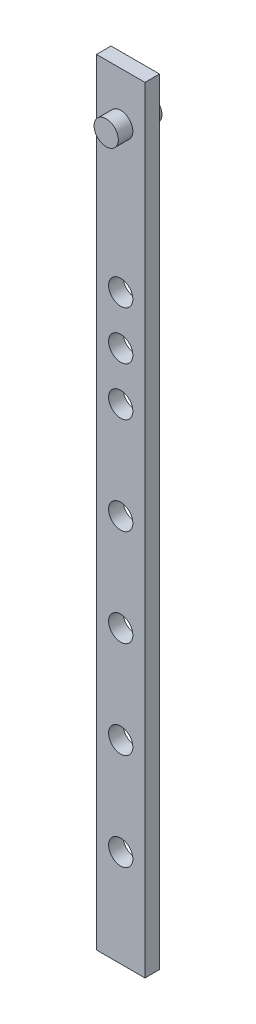
ISO-10303-21;
HEADER;
FILE_DESCRIPTION(('STEP AP214'),'2;1');
FILE_NAME('part.step','',(''),(''),'','','');
FILE_SCHEMA(('AUTOMOTIVE_DESIGN { 1 0 10303 214 1 1 1 1 }'));
ENDSEC;
DATA;
#1=APPLICATION_CONTEXT('core data for automotive mechanical design processes');
#2=APPLICATION_PROTOCOL_DEFINITION('international standard','automotive_design',2000,#1);
#3=PRODUCT_CONTEXT('',#1,'mechanical');
#4=PRODUCT('Part','Part','',(#3));
#5=PRODUCT_RELATED_PRODUCT_CATEGORY('part','',(#4));
#6=PRODUCT_DEFINITION_FORMATION('','',#4);
#7=PRODUCT_DEFINITION_CONTEXT('part definition',#1,'design');
#8=PRODUCT_DEFINITION('design','',#6,#7);
#9=PRODUCT_DEFINITION_SHAPE('','',#8);
#10=(LENGTH_UNIT() NAMED_UNIT(*) SI_UNIT(.MILLI.,.METRE.));
#11=(NAMED_UNIT(*) PLANE_ANGLE_UNIT() SI_UNIT($,.RADIAN.));
#12=(NAMED_UNIT(*) SI_UNIT($,.STERADIAN.) SOLID_ANGLE_UNIT());
#13=UNCERTAINTY_MEASURE_WITH_UNIT(LENGTH_MEASURE(1.E-05),#10,'distance_accuracy_value','');
#14=(GEOMETRIC_REPRESENTATION_CONTEXT(3) GLOBAL_UNCERTAINTY_ASSIGNED_CONTEXT((#13)) GLOBAL_UNIT_ASSIGNED_CONTEXT((#10,
#11,#12)) REPRESENTATION_CONTEXT('',''));
#15=CARTESIAN_POINT('',(0.,0.,0.));
#16=DIRECTION('',(0.,0.,1.));
#17=DIRECTION('',(1.,0.,0.));
#18=AXIS2_PLACEMENT_3D('',#15,#16,#17);
#19=CARTESIAN_POINT('',(0.,0.,3.));
#20=DIRECTION('',(0.,0.,-1.));
#21=DIRECTION('',(-1.,0.,0.));
#22=AXIS2_PLACEMENT_3D('',#19,#20,#21);
#23=PLANE('',#22);
#24=CARTESIAN_POINT('',(0.,70.,3.));
#25=DIRECTION('',(0.,0.,-1.));
#26=DIRECTION('',(-1.,0.,0.));
#27=AXIS2_PLACEMENT_3D('',#24,#25,#26);
#28=CIRCLE('',#27,2.5);
#29=CARTESIAN_POINT('',(-2.5,70.,3.));
#30=VERTEX_POINT('',#29);
#31=EDGE_CURVE('E11',#30,#30,#28,.F.);
#32=ORIENTED_EDGE('',*,*,#31,.F.);
#33=EDGE_LOOP('',(#32));
#34=FACE_BOUND('',#33,.T.);
#35=DIRECTION('',(0.,1.,0.));
#36=VECTOR('',#35,1.);
#37=CARTESIAN_POINT('',(4.99999999999997,-80.,3.));
#38=LINE('',#37,#36);
#39=CARTESIAN_POINT('',(4.99999999999997,-80.,3.));
#40=VERTEX_POINT('',#39);
#41=CARTESIAN_POINT('',(5.00000000000003,80.,3.));
#42=VERTEX_POINT('',#41);
#43=EDGE_CURVE('E88',#40,#42,#38,.T.);
#44=ORIENTED_EDGE('',*,*,#43,.T.);
#45=DIRECTION('',(-1.,0.,0.));
#46=VECTOR('',#45,1.);
#47=CARTESIAN_POINT('',(-4.99999999999997,80.,3.));
#48=LINE('',#47,#46);
#49=CARTESIAN_POINT('',(-4.99999999999997,80.,3.));
#50=VERTEX_POINT('',#49);
#51=EDGE_CURVE('E83',#42,#50,#48,.T.);
#52=ORIENTED_EDGE('',*,*,#51,.T.);
#53=DIRECTION('',(0.,-1.,0.));
#54=VECTOR('',#53,1.);
#55=CARTESIAN_POINT('',(-4.99999999999997,-80.,3.));
#56=LINE('',#55,#54);
#57=CARTESIAN_POINT('',(-4.99999999999997,-80.,3.));
#58=VERTEX_POINT('',#57);
#59=EDGE_CURVE('E86',#50,#58,#56,.T.);
#60=ORIENTED_EDGE('',*,*,#59,.T.);
#61=DIRECTION('',(1.,0.,0.));
#62=VECTOR('',#61,1.);
#63=CARTESIAN_POINT('',(-4.99999999999997,-80.,3.));
#64=LINE('',#63,#62);
#65=EDGE_CURVE('E52',#58,#40,#64,.T.);
#66=ORIENTED_EDGE('',*,*,#65,.T.);
#67=EDGE_LOOP('',(#44,#52,#60,#66));
#68=FACE_BOUND('',#67,.T.);
#69=CARTESIAN_POINT('',(0.,-60.,3.));
#70=DIRECTION('',(0.,0.,1.));
#71=DIRECTION('',(1.,0.,0.));
#72=AXIS2_PLACEMENT_3D('',#69,#70,#71);
#73=CIRCLE('',#72,2.5);
#74=CARTESIAN_POINT('',(2.5,-60.,3.));
#75=VERTEX_POINT('',#74);
#76=EDGE_CURVE('E105',#75,#75,#73,.T.);
#77=ORIENTED_EDGE('',*,*,#76,.F.);
#78=EDGE_LOOP('',(#77));
#79=FACE_BOUND('',#78,.T.);
#80=CARTESIAN_POINT('',(0.,-40.,3.));
#81=DIRECTION('',(0.,0.,1.));
#82=DIRECTION('',(1.,0.,0.));
#83=AXIS2_PLACEMENT_3D('',#80,#81,#82);
#84=CIRCLE('',#83,2.5);
#85=CARTESIAN_POINT('',(2.5,-40.,3.));
#86=VERTEX_POINT('',#85);
#87=EDGE_CURVE('E162',#86,#86,#84,.T.);
#88=ORIENTED_EDGE('',*,*,#87,.F.);
#89=EDGE_LOOP('',(#88));
#90=FACE_BOUND('',#89,.T.);
#91=CARTESIAN_POINT('',(0.,-20.,3.));
#92=DIRECTION('',(0.,0.,1.));
#93=DIRECTION('',(1.,0.,0.));
#94=AXIS2_PLACEMENT_3D('',#91,#92,#93);
#95=CIRCLE('',#94,2.5);
#96=CARTESIAN_POINT('',(2.5,-20.,3.));
#97=VERTEX_POINT('',#96);
#98=EDGE_CURVE('E157',#97,#97,#95,.T.);
#99=ORIENTED_EDGE('',*,*,#98,.F.);
#100=EDGE_LOOP('',(#99));
#101=FACE_BOUND('',#100,.T.);
#102=CARTESIAN_POINT('',(0.,0.,3.));
#103=DIRECTION('',(0.,0.,1.));
#104=DIRECTION('',(1.,0.,0.));
#105=AXIS2_PLACEMENT_3D('',#102,#103,#104);
#106=CIRCLE('',#105,2.5);
#107=CARTESIAN_POINT('',(2.5,0.,3.));
#108=VERTEX_POINT('',#107);
#109=EDGE_CURVE('E152',#108,#108,#106,.T.);
#110=ORIENTED_EDGE('',*,*,#109,.F.);
#111=EDGE_LOOP('',(#110));
#112=FACE_BOUND('',#111,.T.);
#113=CARTESIAN_POINT('',(0.,20.,3.));
#114=DIRECTION('',(0.,0.,1.));
#115=DIRECTION('',(1.,0.,0.));
#116=AXIS2_PLACEMENT_3D('',#113,#114,#115);
#117=CIRCLE('',#116,2.5);
#118=CARTESIAN_POINT('',(2.5,20.,3.));
#119=VERTEX_POINT('',#118);
#120=EDGE_CURVE('E147',#119,#119,#117,.T.);
#121=ORIENTED_EDGE('',*,*,#120,.F.);
#122=EDGE_LOOP('',(#121));
#123=FACE_BOUND('',#122,.T.);
#124=CARTESIAN_POINT('',(0.,40.,3.));
#125=DIRECTION('',(0.,0.,1.));
#126=DIRECTION('',(1.,0.,0.));
#127=AXIS2_PLACEMENT_3D('',#124,#125,#126);
#128=CIRCLE('',#127,2.5);
#129=CARTESIAN_POINT('',(2.5,40.,3.));
#130=VERTEX_POINT('',#129);
#131=EDGE_CURVE('E142',#130,#130,#128,.T.);
#132=ORIENTED_EDGE('',*,*,#131,.F.);
#133=EDGE_LOOP('',(#132));
#134=FACE_BOUND('',#133,.T.);
#135=CARTESIAN_POINT('',(0.,30.,3.));
#136=DIRECTION('',(0.,0.,1.));
#137=DIRECTION('',(1.,0.,0.));
#138=AXIS2_PLACEMENT_3D('',#135,#136,#137);
#139=CIRCLE('',#138,2.5);
#140=CARTESIAN_POINT('',(2.5,30.,3.));
#141=VERTEX_POINT('',#140);
#142=EDGE_CURVE('E134',#141,#141,#139,.T.);
#143=ORIENTED_EDGE('',*,*,#142,.F.);
#144=EDGE_LOOP('',(#143));
#145=FACE_BOUND('',#144,.T.);
#146=ADVANCED_FACE('F33',(#34,#68,#79,#90,#101,#112,#123,#134,#145),#23,.F.);
#147=CARTESIAN_POINT('',(0.,0.,0.));
#148=DIRECTION('',(0.,0.,-1.));
#149=DIRECTION('',(-1.,0.,0.));
#150=AXIS2_PLACEMENT_3D('',#147,#148,#149);
#151=PLANE('',#150);
#152=CARTESIAN_POINT('',(0.,70.,0.));
#153=DIRECTION('',(0.,0.,-1.));
#154=DIRECTION('',(-1.,0.,0.));
#155=AXIS2_PLACEMENT_3D('',#152,#153,#154);
#156=CIRCLE('',#155,2.5);
#157=CARTESIAN_POINT('',(-2.5,70.,0.));
#158=VERTEX_POINT('',#157);
#159=EDGE_CURVE('E37',#158,#158,#156,.F.);
#160=ORIENTED_EDGE('',*,*,#159,.T.);
#161=EDGE_LOOP('',(#160));
#162=FACE_BOUND('',#161,.T.);
#163=CARTESIAN_POINT('',(0.,40.,0.));
#164=DIRECTION('',(0.,0.,1.));
#165=DIRECTION('',(1.,0.,0.));
#166=AXIS2_PLACEMENT_3D('',#163,#164,#165);
#167=CIRCLE('',#166,2.5);
#168=CARTESIAN_POINT('',(2.5,40.,0.));
#169=VERTEX_POINT('',#168);
#170=EDGE_CURVE('E137',#169,#169,#167,.T.);
#171=ORIENTED_EDGE('',*,*,#170,.T.);
#172=EDGE_LOOP('',(#171));
#173=FACE_BOUND('',#172,.T.);
#174=CARTESIAN_POINT('',(0.,0.,0.));
#175=DIRECTION('',(0.,0.,1.));
#176=DIRECTION('',(1.,0.,0.));
#177=AXIS2_PLACEMENT_3D('',#174,#175,#176);
#178=CIRCLE('',#177,2.5);
#179=CARTESIAN_POINT('',(2.5,0.,0.));
#180=VERTEX_POINT('',#179);
#181=EDGE_CURVE('E150',#180,#180,#178,.T.);
#182=ORIENTED_EDGE('',*,*,#181,.T.);
#183=EDGE_LOOP('',(#182));
#184=FACE_BOUND('',#183,.T.);
#185=CARTESIAN_POINT('',(0.,-40.,0.));
#186=DIRECTION('',(0.,0.,1.));
#187=DIRECTION('',(1.,0.,0.));
#188=AXIS2_PLACEMENT_3D('',#185,#186,#187);
#189=CIRCLE('',#188,2.5);
#190=CARTESIAN_POINT('',(2.5,-40.,0.));
#191=VERTEX_POINT('',#190);
#192=EDGE_CURVE('E160',#191,#191,#189,.T.);
#193=ORIENTED_EDGE('',*,*,#192,.T.);
#194=EDGE_LOOP('',(#193));
#195=FACE_BOUND('',#194,.T.);
#196=DIRECTION('',(0.,1.,0.));
#197=VECTOR('',#196,1.);
#198=CARTESIAN_POINT('',(4.99999999999997,-80.,0.));
#199=LINE('',#198,#197);
#200=CARTESIAN_POINT('',(4.99999999999997,-80.,0.));
#201=VERTEX_POINT('',#200);
#202=CARTESIAN_POINT('',(5.00000000000003,80.,0.));
#203=VERTEX_POINT('',#202);
#204=EDGE_CURVE('E102',#201,#203,#199,.T.);
#205=ORIENTED_EDGE('',*,*,#204,.F.);
#206=DIRECTION('',(1.,0.,0.));
#207=VECTOR('',#206,1.);
#208=CARTESIAN_POINT('',(-4.99999999999997,-80.,0.));
#209=LINE('',#208,#207);
#210=CARTESIAN_POINT('',(-4.99999999999997,-80.,0.));
#211=VERTEX_POINT('',#210);
#212=EDGE_CURVE('E75',#211,#201,#209,.T.);
#213=ORIENTED_EDGE('',*,*,#212,.F.);
#214=DIRECTION('',(0.,-1.,0.));
#215=VECTOR('',#214,1.);
#216=CARTESIAN_POINT('',(-4.99999999999997,-80.,0.));
#217=LINE('',#216,#215);
#218=CARTESIAN_POINT('',(-4.99999999999997,80.,0.));
#219=VERTEX_POINT('',#218);
#220=EDGE_CURVE('E69',#219,#211,#217,.T.);
#221=ORIENTED_EDGE('',*,*,#220,.F.);
#222=DIRECTION('',(-1.,0.,0.));
#223=VECTOR('',#222,1.);
#224=CARTESIAN_POINT('',(-4.99999999999997,80.,0.));
#225=LINE('',#224,#223);
#226=EDGE_CURVE('E93',#203,#219,#225,.T.);
#227=ORIENTED_EDGE('',*,*,#226,.F.);
#228=EDGE_LOOP('',(#205,#213,#221,#227));
#229=FACE_BOUND('',#228,.T.);
#230=CARTESIAN_POINT('',(0.,-60.,0.));
#231=DIRECTION('',(0.,0.,1.));
#232=DIRECTION('',(1.,0.,0.));
#233=AXIS2_PLACEMENT_3D('',#230,#231,#232);
#234=CIRCLE('',#233,2.5);
#235=CARTESIAN_POINT('',(2.5,-60.,0.));
#236=VERTEX_POINT('',#235);
#237=EDGE_CURVE('E121',#236,#236,#234,.T.);
#238=ORIENTED_EDGE('',*,*,#237,.T.);
#239=EDGE_LOOP('',(#238));
#240=FACE_BOUND('',#239,.T.);
#241=CARTESIAN_POINT('',(0.,-20.,0.));
#242=DIRECTION('',(0.,0.,1.));
#243=DIRECTION('',(1.,0.,0.));
#244=AXIS2_PLACEMENT_3D('',#241,#242,#243);
#245=CIRCLE('',#244,2.5);
#246=CARTESIAN_POINT('',(2.5,-20.,0.));
#247=VERTEX_POINT('',#246);
#248=EDGE_CURVE('E125',#247,#247,#245,.T.);
#249=ORIENTED_EDGE('',*,*,#248,.T.);
#250=EDGE_LOOP('',(#249));
#251=FACE_BOUND('',#250,.T.);
#252=CARTESIAN_POINT('',(0.,20.,0.));
#253=DIRECTION('',(0.,0.,1.));
#254=DIRECTION('',(1.,0.,0.));
#255=AXIS2_PLACEMENT_3D('',#252,#253,#254);
#256=CIRCLE('',#255,2.5);
#257=CARTESIAN_POINT('',(2.5,20.,0.));
#258=VERTEX_POINT('',#257);
#259=EDGE_CURVE('E129',#258,#258,#256,.T.);
#260=ORIENTED_EDGE('',*,*,#259,.T.);
#261=EDGE_LOOP('',(#260));
#262=FACE_BOUND('',#261,.T.);
#263=CARTESIAN_POINT('',(0.,30.,0.));
#264=DIRECTION('',(0.,0.,1.));
#265=DIRECTION('',(1.,0.,0.));
#266=AXIS2_PLACEMENT_3D('',#263,#264,#265);
#267=CIRCLE('',#266,2.5);
#268=CARTESIAN_POINT('',(2.5,30.,0.));
#269=VERTEX_POINT('',#268);
#270=EDGE_CURVE('E132',#269,#269,#267,.T.);
#271=ORIENTED_EDGE('',*,*,#270,.T.);
#272=EDGE_LOOP('',(#271));
#273=FACE_BOUND('',#272,.T.);
#274=ADVANCED_FACE('F113',(#162,#173,#184,#195,#229,#240,#251,#262,#273),#151,.T.);
#275=CARTESIAN_POINT('',(4.99999999999997,-80.,3.));
#276=DIRECTION('',(-1.,0.,0.));
#277=DIRECTION('',(0.,-1.,0.));
#278=AXIS2_PLACEMENT_3D('',#275,#276,#277);
#279=PLANE('',#278);
#280=ORIENTED_EDGE('',*,*,#204,.T.);
#281=DIRECTION('',(0.,0.,-1.));
#282=VECTOR('',#281,1.);
#283=CARTESIAN_POINT('',(5.00000000000003,80.,3.));
#284=LINE('',#283,#282);
#285=EDGE_CURVE('E43',#42,#203,#284,.T.);
#286=ORIENTED_EDGE('',*,*,#285,.F.);
#287=ORIENTED_EDGE('',*,*,#43,.F.);
#288=DIRECTION('',(0.,0.,-1.));
#289=VECTOR('',#288,1.);
#290=CARTESIAN_POINT('',(4.99999999999997,-80.,3.));
#291=LINE('',#290,#289);
#292=EDGE_CURVE('E98',#40,#201,#291,.T.);
#293=ORIENTED_EDGE('',*,*,#292,.T.);
#294=EDGE_LOOP('',(#280,#286,#287,#293));
#295=FACE_BOUND('',#294,.T.);
#296=ADVANCED_FACE('F35',(#295),#279,.F.);
#297=CARTESIAN_POINT('',(-4.99999999999997,80.,3.));
#298=DIRECTION('',(0.,-1.,0.));
#299=DIRECTION('',(0.,0.,-1.));
#300=AXIS2_PLACEMENT_3D('',#297,#298,#299);
#301=PLANE('',#300);
#302=ORIENTED_EDGE('',*,*,#226,.T.);
#303=DIRECTION('',(0.,0.,-1.));
#304=VECTOR('',#303,1.);
#305=CARTESIAN_POINT('',(-4.99999999999997,80.,3.));
#306=LINE('',#305,#304);
#307=EDGE_CURVE('E91',#50,#219,#306,.T.);
#308=ORIENTED_EDGE('',*,*,#307,.F.);
#309=ORIENTED_EDGE('',*,*,#51,.F.);
#310=ORIENTED_EDGE('',*,*,#285,.T.);
#311=EDGE_LOOP('',(#302,#308,#309,#310));
#312=FACE_BOUND('',#311,.T.);
#313=ADVANCED_FACE('F92',(#312),#301,.F.);
#314=CARTESIAN_POINT('',(-4.99999999999997,-80.,3.));
#315=DIRECTION('',(1.,0.,0.));
#316=DIRECTION('',(0.,0.,-1.));
#317=AXIS2_PLACEMENT_3D('',#314,#315,#316);
#318=PLANE('',#317);
#319=ORIENTED_EDGE('',*,*,#220,.T.);
#320=DIRECTION('',(0.,0.,-1.));
#321=VECTOR('',#320,1.);
#322=CARTESIAN_POINT('',(-4.99999999999997,-80.,3.));
#323=LINE('',#322,#321);
#324=EDGE_CURVE('E94',#58,#211,#323,.T.);
#325=ORIENTED_EDGE('',*,*,#324,.F.);
#326=ORIENTED_EDGE('',*,*,#59,.F.);
#327=ORIENTED_EDGE('',*,*,#307,.T.);
#328=EDGE_LOOP('',(#319,#325,#326,#327));
#329=FACE_BOUND('',#328,.T.);
#330=ADVANCED_FACE('F96',(#329),#318,.F.);
#331=CARTESIAN_POINT('',(-4.99999999999997,-80.,3.));
#332=DIRECTION('',(0.,1.,0.));
#333=DIRECTION('',(0.,0.,1.));
#334=AXIS2_PLACEMENT_3D('',#331,#332,#333);
#335=PLANE('',#334);
#336=ORIENTED_EDGE('',*,*,#212,.T.);
#337=ORIENTED_EDGE('',*,*,#292,.F.);
#338=ORIENTED_EDGE('',*,*,#65,.F.);
#339=ORIENTED_EDGE('',*,*,#324,.T.);
#340=EDGE_LOOP('',(#336,#337,#338,#339));
#341=FACE_BOUND('',#340,.T.);
#342=ADVANCED_FACE('F223',(#341),#335,.F.);
#343=CARTESIAN_POINT('',(0.,-60.,3.));
#344=DIRECTION('',(0.,0.,-1.));
#345=DIRECTION('',(-1.,0.,0.));
#346=AXIS2_PLACEMENT_3D('',#343,#344,#345);
#347=CYLINDRICAL_SURFACE('',#346,2.5);
#348=ORIENTED_EDGE('',*,*,#76,.T.);
#349=EDGE_LOOP('',(#348));
#350=FACE_BOUND('',#349,.T.);
#351=ORIENTED_EDGE('',*,*,#237,.F.);
#352=EDGE_LOOP('',(#351));
#353=FACE_BOUND('',#352,.T.);
#354=ADVANCED_FACE('F171',(#350,#353),#347,.F.);
#355=CARTESIAN_POINT('',(0.,-40.,3.));
#356=DIRECTION('',(0.,0.,-1.));
#357=DIRECTION('',(-1.,0.,0.));
#358=AXIS2_PLACEMENT_3D('',#355,#356,#357);
#359=CYLINDRICAL_SURFACE('',#358,2.5);
#360=ORIENTED_EDGE('',*,*,#87,.T.);
#361=EDGE_LOOP('',(#360));
#362=FACE_BOUND('',#361,.T.);
#363=ORIENTED_EDGE('',*,*,#192,.F.);
#364=EDGE_LOOP('',(#363));
#365=FACE_BOUND('',#364,.T.);
#366=ADVANCED_FACE('F217',(#362,#365),#359,.F.);
#367=CARTESIAN_POINT('',(0.,-20.,3.));
#368=DIRECTION('',(0.,0.,-1.));
#369=DIRECTION('',(-1.,0.,0.));
#370=AXIS2_PLACEMENT_3D('',#367,#368,#369);
#371=CYLINDRICAL_SURFACE('',#370,2.5);
#372=ORIENTED_EDGE('',*,*,#98,.T.);
#373=EDGE_LOOP('',(#372));
#374=FACE_BOUND('',#373,.T.);
#375=ORIENTED_EDGE('',*,*,#248,.F.);
#376=EDGE_LOOP('',(#375));
#377=FACE_BOUND('',#376,.T.);
#378=ADVANCED_FACE('F213',(#374,#377),#371,.F.);
#379=CARTESIAN_POINT('',(0.,0.,3.));
#380=DIRECTION('',(0.,0.,-1.));
#381=DIRECTION('',(-1.,0.,0.));
#382=AXIS2_PLACEMENT_3D('',#379,#380,#381);
#383=CYLINDRICAL_SURFACE('',#382,2.5);
#384=ORIENTED_EDGE('',*,*,#109,.T.);
#385=EDGE_LOOP('',(#384));
#386=FACE_BOUND('',#385,.T.);
#387=ORIENTED_EDGE('',*,*,#181,.F.);
#388=EDGE_LOOP('',(#387));
#389=FACE_BOUND('',#388,.T.);
#390=ADVANCED_FACE('F209',(#386,#389),#383,.F.);
#391=CARTESIAN_POINT('',(0.,20.,3.));
#392=DIRECTION('',(0.,0.,-1.));
#393=DIRECTION('',(-1.,0.,0.));
#394=AXIS2_PLACEMENT_3D('',#391,#392,#393);
#395=CYLINDRICAL_SURFACE('',#394,2.5);
#396=ORIENTED_EDGE('',*,*,#120,.T.);
#397=EDGE_LOOP('',(#396));
#398=FACE_BOUND('',#397,.T.);
#399=ORIENTED_EDGE('',*,*,#259,.F.);
#400=EDGE_LOOP('',(#399));
#401=FACE_BOUND('',#400,.T.);
#402=ADVANCED_FACE('F201',(#398,#401),#395,.F.);
#403=CARTESIAN_POINT('',(0.,40.,3.));
#404=DIRECTION('',(0.,0.,-1.));
#405=DIRECTION('',(-1.,0.,0.));
#406=AXIS2_PLACEMENT_3D('',#403,#404,#405);
#407=CYLINDRICAL_SURFACE('',#406,2.5);
#408=ORIENTED_EDGE('',*,*,#131,.T.);
#409=EDGE_LOOP('',(#408));
#410=FACE_BOUND('',#409,.T.);
#411=ORIENTED_EDGE('',*,*,#170,.F.);
#412=EDGE_LOOP('',(#411));
#413=FACE_BOUND('',#412,.T.);
#414=ADVANCED_FACE('F192',(#410,#413),#407,.F.);
#415=CARTESIAN_POINT('',(0.,30.,3.));
#416=DIRECTION('',(0.,0.,-1.));
#417=DIRECTION('',(-1.,0.,0.));
#418=AXIS2_PLACEMENT_3D('',#415,#416,#417);
#419=CYLINDRICAL_SURFACE('',#418,2.5);
#420=ORIENTED_EDGE('',*,*,#142,.T.);
#421=EDGE_LOOP('',(#420));
#422=FACE_BOUND('',#421,.T.);
#423=ORIENTED_EDGE('',*,*,#270,.F.);
#424=EDGE_LOOP('',(#423));
#425=FACE_BOUND('',#424,.T.);
#426=ADVANCED_FACE('F189',(#422,#425),#419,.F.);
#427=CARTESIAN_POINT('',(0.,70.,-3.));
#428=DIRECTION('',(0.,0.,1.));
#429=DIRECTION('',(1.,0.,0.));
#430=AXIS2_PLACEMENT_3D('',#427,#428,#429);
#431=PLANE('',#430);
#432=CARTESIAN_POINT('',(0.,70.,-3.));
#433=DIRECTION('',(0.,0.,1.));
#434=DIRECTION('',(1.,0.,0.));
#435=AXIS2_PLACEMENT_3D('',#432,#433,#434);
#436=CIRCLE('',#435,2.5);
#437=CARTESIAN_POINT('',(2.5,70.,-3.));
#438=VERTEX_POINT('',#437);
#439=EDGE_CURVE('E340',#438,#438,#436,.T.);
#440=ORIENTED_EDGE('',*,*,#439,.F.);
#441=EDGE_LOOP('',(#440));
#442=FACE_BOUND('',#441,.T.);
#443=ADVANCED_FACE('F191',(#442),#431,.F.);
#444=CARTESIAN_POINT('',(0.,70.,6.));
#445=DIRECTION('',(0.,0.,-1.));
#446=DIRECTION('',(-1.,0.,0.));
#447=AXIS2_PLACEMENT_3D('',#444,#445,#446);
#448=CYLINDRICAL_SURFACE('',#447,2.5);
#449=ORIENTED_EDGE('',*,*,#159,.F.);
#450=EDGE_LOOP('',(#449));
#451=FACE_BOUND('',#450,.T.);
#452=ORIENTED_EDGE('',*,*,#439,.T.);
#453=EDGE_LOOP('',(#452));
#454=FACE_BOUND('',#453,.T.);
#455=ADVANCED_FACE('F198',(#451,#454),#448,.T.);
#456=CARTESIAN_POINT('',(0.,70.,6.));
#457=DIRECTION('',(0.,0.,1.));
#458=DIRECTION('',(1.,0.,0.));
#459=AXIS2_PLACEMENT_3D('',#456,#457,#458);
#460=CIRCLE('',#459,2.5);
#461=CARTESIAN_POINT('',(2.5,70.,6.));
#462=VERTEX_POINT('',#461);
#463=EDGE_CURVE('E140',#462,#462,#460,.T.);
#464=ORIENTED_EDGE('',*,*,#463,.F.);
#465=EDGE_LOOP('',(#464));
#466=FACE_BOUND('',#465,.T.);
#467=ORIENTED_EDGE('',*,*,#31,.T.);
#468=EDGE_LOOP('',(#467));
#469=FACE_BOUND('',#468,.T.);
#470=ADVANCED_FACE('F317',(#466,#469),#448,.T.);
#471=CARTESIAN_POINT('',(0.,70.,6.));
#472=DIRECTION('',(0.,0.,1.));
#473=DIRECTION('',(1.,0.,0.));
#474=AXIS2_PLACEMENT_3D('',#471,#472,#473);
#475=PLANE('',#474);
#476=ORIENTED_EDGE('',*,*,#463,.T.);
#477=EDGE_LOOP('',(#476));
#478=FACE_BOUND('',#477,.T.);
#479=ADVANCED_FACE('F325',(#478),#475,.T.);
#480=CLOSED_SHELL('',(#146,#274,#296,#313,#330,#342,#354,#366,#378,#390,#402,#414,#426,#443,
#455,#470,#479));
#481=MANIFOLD_SOLID_BREP('B2',#480);
#482=ADVANCED_BREP_SHAPE_REPRESENTATION('',(#18,#481),#14);
#483=SHAPE_DEFINITION_REPRESENTATION(#9,#482);
ENDSEC;
END-ISO-10303-21;
